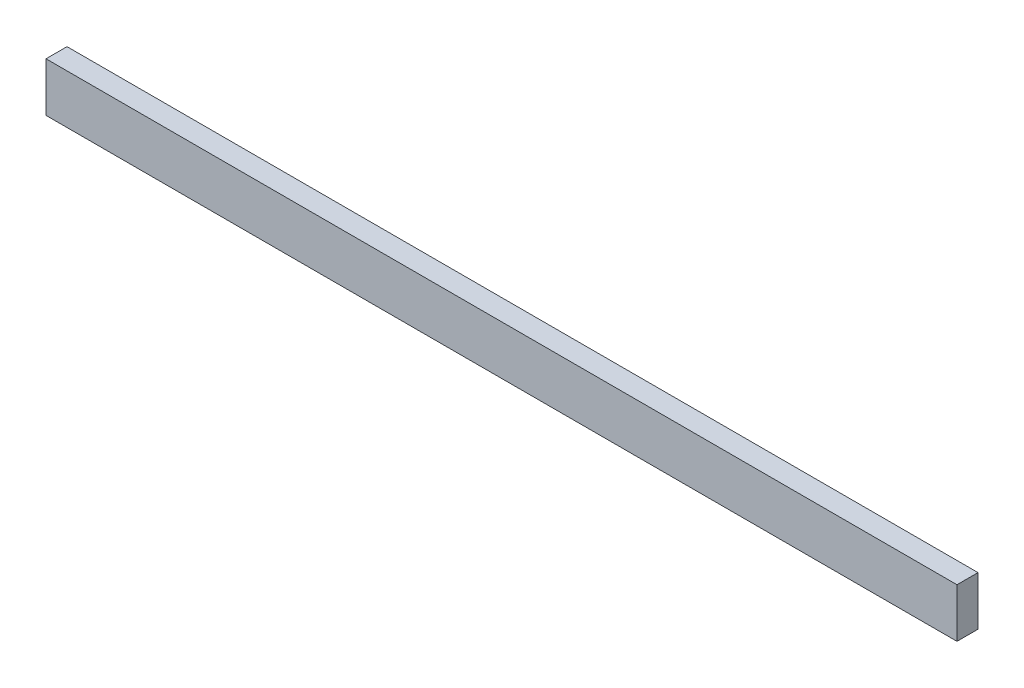
ISO-10303-21;
HEADER;
FILE_DESCRIPTION(('STEP AP214'),'2;1');
FILE_NAME('part.step','',(''),(''),'','','');
FILE_SCHEMA(('AUTOMOTIVE_DESIGN { 1 0 10303 214 1 1 1 1 }'));
ENDSEC;
DATA;
#1=APPLICATION_CONTEXT('core data for automotive mechanical design processes');
#2=APPLICATION_PROTOCOL_DEFINITION('international standard','automotive_design',2000,#1);
#3=PRODUCT_CONTEXT('',#1,'mechanical');
#4=PRODUCT('Part','Part','',(#3));
#5=PRODUCT_RELATED_PRODUCT_CATEGORY('part','',(#4));
#6=PRODUCT_DEFINITION_FORMATION('','',#4);
#7=PRODUCT_DEFINITION_CONTEXT('part definition',#1,'design');
#8=PRODUCT_DEFINITION('design','',#6,#7);
#9=PRODUCT_DEFINITION_SHAPE('','',#8);
#10=(LENGTH_UNIT() NAMED_UNIT(*) SI_UNIT(.MILLI.,.METRE.));
#11=(NAMED_UNIT(*) PLANE_ANGLE_UNIT() SI_UNIT($,.RADIAN.));
#12=(NAMED_UNIT(*) SI_UNIT($,.STERADIAN.) SOLID_ANGLE_UNIT());
#13=UNCERTAINTY_MEASURE_WITH_UNIT(LENGTH_MEASURE(1.E-05),#10,'distance_accuracy_value','');
#14=(GEOMETRIC_REPRESENTATION_CONTEXT(3) GLOBAL_UNCERTAINTY_ASSIGNED_CONTEXT((#13)) GLOBAL_UNIT_ASSIGNED_CONTEXT((#10,
#11,#12)) REPRESENTATION_CONTEXT('',''));
#15=CARTESIAN_POINT('',(0.,0.,0.));
#16=DIRECTION('',(0.,0.,1.));
#17=DIRECTION('',(1.,0.,0.));
#18=AXIS2_PLACEMENT_3D('',#15,#16,#17);
#19=CARTESIAN_POINT('',(0.,35.,15.));
#20=DIRECTION('',(1.,0.,0.));
#21=DIRECTION('',(0.,0.,-1.));
#22=AXIS2_PLACEMENT_3D('',#19,#20,#21);
#23=PLANE('',#22);
#24=DIRECTION('',(0.,-1.,0.));
#25=VECTOR('',#24,1.);
#26=CARTESIAN_POINT('',(0.,35.,0.));
#27=LINE('',#26,#25);
#28=CARTESIAN_POINT('',(0.,35.,0.));
#29=VERTEX_POINT('',#28);
#30=CARTESIAN_POINT('',(0.,0.,0.));
#31=VERTEX_POINT('',#30);
#32=EDGE_CURVE('E102',#29,#31,#27,.T.);
#33=ORIENTED_EDGE('',*,*,#32,.T.);
#34=DIRECTION('',(0.,0.,-1.));
#35=VECTOR('',#34,1.);
#36=CARTESIAN_POINT('',(0.,0.,15.));
#37=LINE('',#36,#35);
#38=CARTESIAN_POINT('',(0.,0.,15.));
#39=VERTEX_POINT('',#38);
#40=EDGE_CURVE('E11',#39,#31,#37,.T.);
#41=ORIENTED_EDGE('',*,*,#40,.F.);
#42=DIRECTION('',(0.,-1.,0.));
#43=VECTOR('',#42,1.);
#44=CARTESIAN_POINT('',(0.,35.,15.));
#45=LINE('',#44,#43);
#46=CARTESIAN_POINT('',(0.,35.,15.));
#47=VERTEX_POINT('',#46);
#48=EDGE_CURVE('E90',#47,#39,#45,.T.);
#49=ORIENTED_EDGE('',*,*,#48,.F.);
#50=DIRECTION('',(0.,0.,-1.));
#51=VECTOR('',#50,1.);
#52=CARTESIAN_POINT('',(0.,35.,15.));
#53=LINE('',#52,#51);
#54=EDGE_CURVE('E98',#47,#29,#53,.T.);
#55=ORIENTED_EDGE('',*,*,#54,.T.);
#56=EDGE_LOOP('',(#33,#41,#49,#55));
#57=FACE_BOUND('',#56,.T.);
#58=ADVANCED_FACE('F39',(#57),#23,.F.);
#59=CARTESIAN_POINT('',(0.,0.,15.));
#60=DIRECTION('',(0.,1.,0.));
#61=DIRECTION('',(0.,0.,1.));
#62=AXIS2_PLACEMENT_3D('',#59,#60,#61);
#63=PLANE('',#62);
#64=DIRECTION('',(1.,0.,0.));
#65=VECTOR('',#64,1.);
#66=CARTESIAN_POINT('',(0.,0.,0.));
#67=LINE('',#66,#65);
#68=CARTESIAN_POINT('',(650.,0.,0.));
#69=VERTEX_POINT('',#68);
#70=EDGE_CURVE('E94',#31,#69,#67,.T.);
#71=ORIENTED_EDGE('',*,*,#70,.T.);
#72=DIRECTION('',(0.,0.,-1.));
#73=VECTOR('',#72,1.);
#74=CARTESIAN_POINT('',(650.,0.,15.));
#75=LINE('',#74,#73);
#76=CARTESIAN_POINT('',(650.,0.,15.));
#77=VERTEX_POINT('',#76);
#78=EDGE_CURVE('E47',#77,#69,#75,.T.);
#79=ORIENTED_EDGE('',*,*,#78,.F.);
#80=DIRECTION('',(1.,0.,0.));
#81=VECTOR('',#80,1.);
#82=CARTESIAN_POINT('',(0.,0.,15.));
#83=LINE('',#82,#81);
#84=EDGE_CURVE('E85',#39,#77,#83,.T.);
#85=ORIENTED_EDGE('',*,*,#84,.F.);
#86=ORIENTED_EDGE('',*,*,#40,.T.);
#87=EDGE_LOOP('',(#71,#79,#85,#86));
#88=FACE_BOUND('',#87,.T.);
#89=ADVANCED_FACE('F93',(#88),#63,.F.);
#90=CARTESIAN_POINT('',(650.,0.,15.));
#91=DIRECTION('',(-1.,0.,0.));
#92=DIRECTION('',(0.,0.,1.));
#93=AXIS2_PLACEMENT_3D('',#90,#91,#92);
#94=PLANE('',#93);
#95=DIRECTION('',(0.,1.,0.));
#96=VECTOR('',#95,1.);
#97=CARTESIAN_POINT('',(650.,0.,0.));
#98=LINE('',#97,#96);
#99=CARTESIAN_POINT('',(650.,35.,0.));
#100=VERTEX_POINT('',#99);
#101=EDGE_CURVE('E72',#69,#100,#98,.T.);
#102=ORIENTED_EDGE('',*,*,#101,.T.);
#103=DIRECTION('',(0.,0.,-1.));
#104=VECTOR('',#103,1.);
#105=CARTESIAN_POINT('',(650.,35.,15.));
#106=LINE('',#105,#104);
#107=CARTESIAN_POINT('',(650.,35.,15.));
#108=VERTEX_POINT('',#107);
#109=EDGE_CURVE('E95',#108,#100,#106,.T.);
#110=ORIENTED_EDGE('',*,*,#109,.F.);
#111=DIRECTION('',(0.,1.,0.));
#112=VECTOR('',#111,1.);
#113=CARTESIAN_POINT('',(650.,0.,15.));
#114=LINE('',#113,#112);
#115=EDGE_CURVE('E88',#77,#108,#114,.T.);
#116=ORIENTED_EDGE('',*,*,#115,.F.);
#117=ORIENTED_EDGE('',*,*,#78,.T.);
#118=EDGE_LOOP('',(#102,#110,#116,#117));
#119=FACE_BOUND('',#118,.T.);
#120=ADVANCED_FACE('F96',(#119),#94,.F.);
#121=CARTESIAN_POINT('',(650.,35.,15.));
#122=DIRECTION('',(0.,-1.,0.));
#123=DIRECTION('',(0.,0.,-1.));
#124=AXIS2_PLACEMENT_3D('',#121,#122,#123);
#125=PLANE('',#124);
#126=DIRECTION('',(-1.,0.,0.));
#127=VECTOR('',#126,1.);
#128=CARTESIAN_POINT('',(650.,35.,0.));
#129=LINE('',#128,#127);
#130=EDGE_CURVE('E78',#100,#29,#129,.T.);
#131=ORIENTED_EDGE('',*,*,#130,.T.);
#132=ORIENTED_EDGE('',*,*,#54,.F.);
#133=DIRECTION('',(-1.,0.,0.));
#134=VECTOR('',#133,1.);
#135=CARTESIAN_POINT('',(650.,35.,15.));
#136=LINE('',#135,#134);
#137=EDGE_CURVE('E55',#108,#47,#136,.T.);
#138=ORIENTED_EDGE('',*,*,#137,.F.);
#139=ORIENTED_EDGE('',*,*,#109,.T.);
#140=EDGE_LOOP('',(#131,#132,#138,#139));
#141=FACE_BOUND('',#140,.T.);
#142=ADVANCED_FACE('F109',(#141),#125,.F.);
#143=CARTESIAN_POINT('',(0.,0.,15.));
#144=DIRECTION('',(0.,0.,1.));
#145=DIRECTION('',(1.,0.,0.));
#146=AXIS2_PLACEMENT_3D('',#143,#144,#145);
#147=PLANE('',#146);
#148=ORIENTED_EDGE('',*,*,#48,.T.);
#149=ORIENTED_EDGE('',*,*,#84,.T.);
#150=ORIENTED_EDGE('',*,*,#115,.T.);
#151=ORIENTED_EDGE('',*,*,#137,.T.);
#152=EDGE_LOOP('',(#148,#149,#150,#151));
#153=FACE_BOUND('',#152,.T.);
#154=ADVANCED_FACE('F86',(#153),#147,.T.);
#155=CARTESIAN_POINT('',(0.,0.,0.));
#156=DIRECTION('',(0.,0.,1.));
#157=DIRECTION('',(1.,0.,0.));
#158=AXIS2_PLACEMENT_3D('',#155,#156,#157);
#159=PLANE('',#158);
#160=ORIENTED_EDGE('',*,*,#32,.F.);
#161=ORIENTED_EDGE('',*,*,#130,.F.);
#162=ORIENTED_EDGE('',*,*,#101,.F.);
#163=ORIENTED_EDGE('',*,*,#70,.F.);
#164=EDGE_LOOP('',(#160,#161,#162,#163));
#165=FACE_BOUND('',#164,.T.);
#166=ADVANCED_FACE('F112',(#165),#159,.F.);
#167=CLOSED_SHELL('',(#58,#89,#120,#142,#154,#166));
#168=MANIFOLD_SOLID_BREP('B2',#167);
#169=ADVANCED_BREP_SHAPE_REPRESENTATION('',(#18,#168),#14);
#170=SHAPE_DEFINITION_REPRESENTATION(#9,#169);
ENDSEC;
END-ISO-10303-21;
